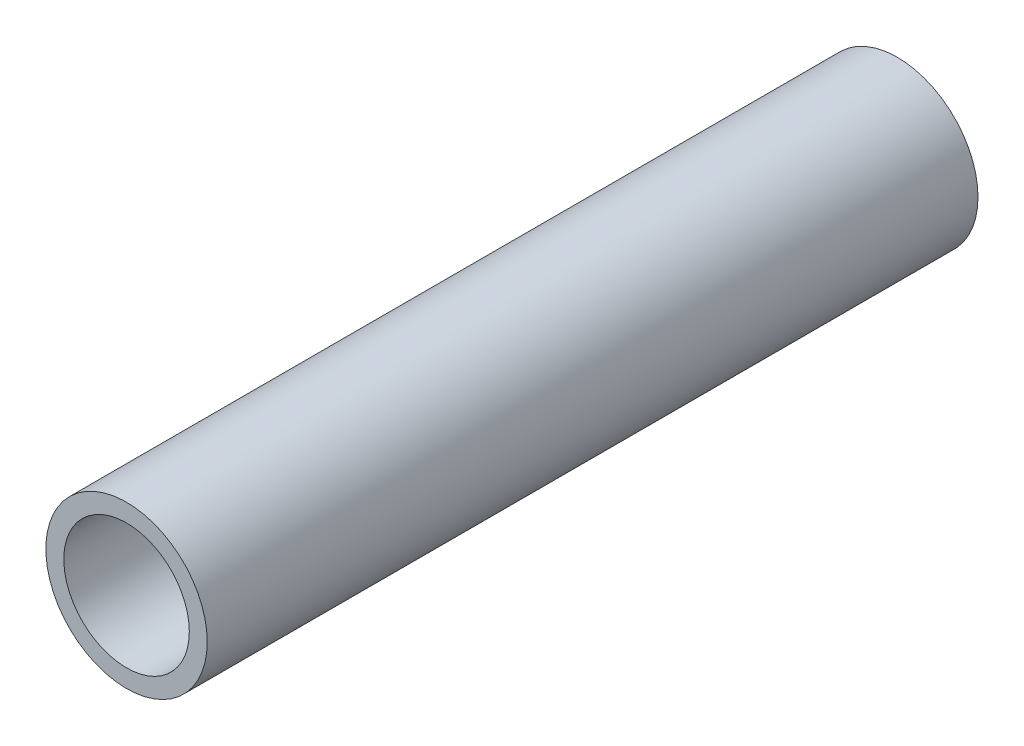
ISO-10303-21;
HEADER;
FILE_DESCRIPTION(('STEP AP214'),'2;1');
FILE_NAME('part.step','',(''),(''),'','','');
FILE_SCHEMA(('AUTOMOTIVE_DESIGN { 1 0 10303 214 1 1 1 1 }'));
ENDSEC;
DATA;
#1=APPLICATION_CONTEXT('core data for automotive mechanical design processes');
#2=APPLICATION_PROTOCOL_DEFINITION('international standard','automotive_design',2000,#1);
#3=PRODUCT_CONTEXT('',#1,'mechanical');
#4=PRODUCT('Part','Part','',(#3));
#5=PRODUCT_RELATED_PRODUCT_CATEGORY('part','',(#4));
#6=PRODUCT_DEFINITION_FORMATION('','',#4);
#7=PRODUCT_DEFINITION_CONTEXT('part definition',#1,'design');
#8=PRODUCT_DEFINITION('design','',#6,#7);
#9=PRODUCT_DEFINITION_SHAPE('','',#8);
#10=(LENGTH_UNIT() NAMED_UNIT(*) SI_UNIT(.MILLI.,.METRE.));
#11=(NAMED_UNIT(*) PLANE_ANGLE_UNIT() SI_UNIT($,.RADIAN.));
#12=(NAMED_UNIT(*) SI_UNIT($,.STERADIAN.) SOLID_ANGLE_UNIT());
#13=UNCERTAINTY_MEASURE_WITH_UNIT(LENGTH_MEASURE(1.E-05),#10,'distance_accuracy_value','');
#14=(GEOMETRIC_REPRESENTATION_CONTEXT(3) GLOBAL_UNCERTAINTY_ASSIGNED_CONTEXT((#13)) GLOBAL_UNIT_ASSIGNED_CONTEXT((#10,
#11,#12)) REPRESENTATION_CONTEXT('',''));
#15=CARTESIAN_POINT('',(0.,0.,0.));
#16=DIRECTION('',(0.,0.,1.));
#17=DIRECTION('',(1.,0.,0.));
#18=AXIS2_PLACEMENT_3D('',#15,#16,#17);
#19=CARTESIAN_POINT('',(0.,0.,42.98));
#20=DIRECTION('',(0.,0.,1.));
#21=DIRECTION('',(1.,0.,0.));
#22=AXIS2_PLACEMENT_3D('',#19,#20,#21);
#23=PLANE('',#22);
#24=CARTESIAN_POINT('',(0.,0.,42.98));
#25=DIRECTION('',(0.,0.,1.));
#26=DIRECTION('',(1.,0.,0.));
#27=AXIS2_PLACEMENT_3D('',#24,#25,#26);
#28=CIRCLE('',#27,9.);
#29=CARTESIAN_POINT('',(9.,0.,42.98));
#30=VERTEX_POINT('',#29);
#31=EDGE_CURVE('E10',#30,#30,#28,.T.);
#32=ORIENTED_EDGE('',*,*,#31,.T.);
#33=EDGE_LOOP('',(#32));
#34=FACE_BOUND('',#33,.T.);
#35=CARTESIAN_POINT('',(0.,0.,42.98));
#36=DIRECTION('',(0.,0.,1.));
#37=DIRECTION('',(1.,0.,0.));
#38=AXIS2_PLACEMENT_3D('',#35,#36,#37);
#39=CIRCLE('',#38,7.);
#40=CARTESIAN_POINT('',(7.,0.,42.98));
#41=VERTEX_POINT('',#40);
#42=EDGE_CURVE('E43',#41,#41,#39,.T.);
#43=ORIENTED_EDGE('',*,*,#42,.F.);
#44=EDGE_LOOP('',(#43));
#45=FACE_BOUND('',#44,.T.);
#46=ADVANCED_FACE('F32',(#34,#45),#23,.T.);
#47=CARTESIAN_POINT('',(0.,0.,-42.98));
#48=DIRECTION('',(0.,0.,1.));
#49=DIRECTION('',(1.,0.,0.));
#50=AXIS2_PLACEMENT_3D('',#47,#48,#49);
#51=PLANE('',#50);
#52=CARTESIAN_POINT('',(0.,0.,-42.98));
#53=DIRECTION('',(0.,0.,1.));
#54=DIRECTION('',(1.,0.,0.));
#55=AXIS2_PLACEMENT_3D('',#52,#53,#54);
#56=CIRCLE('',#55,9.);
#57=CARTESIAN_POINT('',(9.,0.,-42.98));
#58=VERTEX_POINT('',#57);
#59=EDGE_CURVE('E36',#58,#58,#56,.T.);
#60=ORIENTED_EDGE('',*,*,#59,.F.);
#61=EDGE_LOOP('',(#60));
#62=FACE_BOUND('',#61,.T.);
#63=CARTESIAN_POINT('',(0.,0.,-42.98));
#64=DIRECTION('',(0.,0.,1.));
#65=DIRECTION('',(1.,0.,0.));
#66=AXIS2_PLACEMENT_3D('',#63,#64,#65);
#67=CIRCLE('',#66,7.);
#68=CARTESIAN_POINT('',(7.,0.,-42.98));
#69=VERTEX_POINT('',#68);
#70=EDGE_CURVE('E45',#69,#69,#67,.T.);
#71=ORIENTED_EDGE('',*,*,#70,.T.);
#72=EDGE_LOOP('',(#71));
#73=FACE_BOUND('',#72,.T.);
#74=ADVANCED_FACE('F55',(#62,#73),#51,.F.);
#75=CARTESIAN_POINT('',(0.,0.,42.98));
#76=DIRECTION('',(0.,0.,-1.));
#77=DIRECTION('',(-1.,0.,0.));
#78=AXIS2_PLACEMENT_3D('',#75,#76,#77);
#79=CYLINDRICAL_SURFACE('',#78,9.);
#80=ORIENTED_EDGE('',*,*,#31,.F.);
#81=EDGE_LOOP('',(#80));
#82=FACE_BOUND('',#81,.T.);
#83=ORIENTED_EDGE('',*,*,#59,.T.);
#84=EDGE_LOOP('',(#83));
#85=FACE_BOUND('',#84,.T.);
#86=ADVANCED_FACE('F34',(#82,#85),#79,.T.);
#87=CARTESIAN_POINT('',(0.,0.,42.98));
#88=DIRECTION('',(0.,0.,-1.));
#89=DIRECTION('',(-1.,0.,0.));
#90=AXIS2_PLACEMENT_3D('',#87,#88,#89);
#91=CYLINDRICAL_SURFACE('',#90,7.);
#92=ORIENTED_EDGE('',*,*,#42,.T.);
#93=EDGE_LOOP('',(#92));
#94=FACE_BOUND('',#93,.T.);
#95=ORIENTED_EDGE('',*,*,#70,.F.);
#96=EDGE_LOOP('',(#95));
#97=FACE_BOUND('',#96,.T.);
#98=ADVANCED_FACE('F51',(#94,#97),#91,.F.);
#99=CLOSED_SHELL('',(#46,#74,#86,#98));
#100=MANIFOLD_SOLID_BREP('B2',#99);
#101=ADVANCED_BREP_SHAPE_REPRESENTATION('',(#18,#100),#14);
#102=SHAPE_DEFINITION_REPRESENTATION(#9,#101);
ENDSEC;
END-ISO-10303-21;
